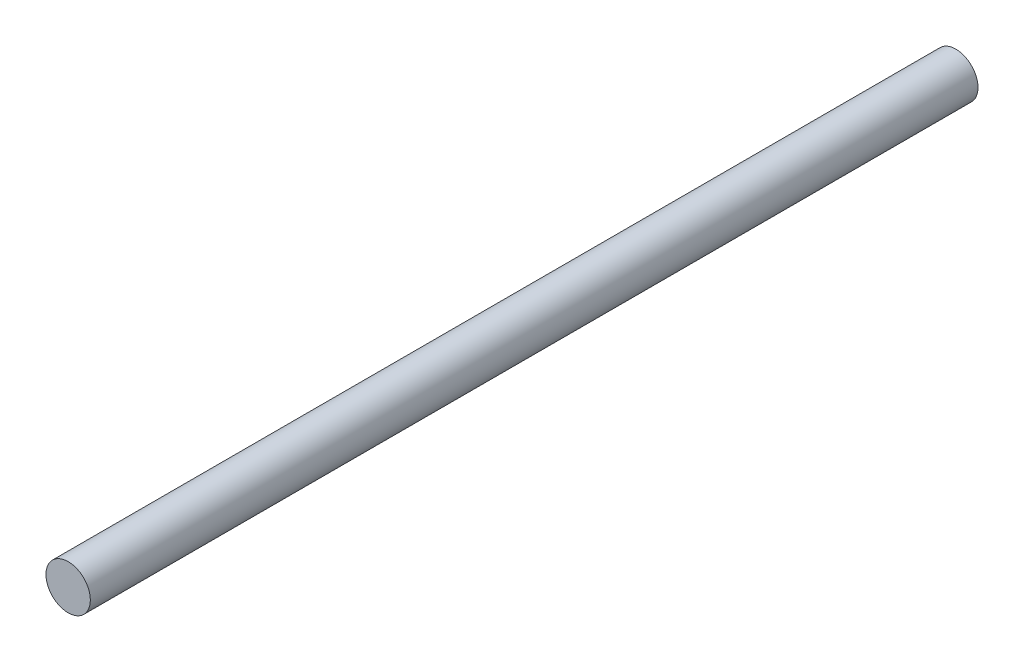
ISO-10303-21;
HEADER;
FILE_DESCRIPTION(('STEP AP214'),'2;1');
FILE_NAME('part.step','',(''),(''),'','','');
FILE_SCHEMA(('AUTOMOTIVE_DESIGN { 1 0 10303 214 1 1 1 1 }'));
ENDSEC;
DATA;
#1=APPLICATION_CONTEXT('core data for automotive mechanical design processes');
#2=APPLICATION_PROTOCOL_DEFINITION('international standard','automotive_design',2000,#1);
#3=PRODUCT_CONTEXT('',#1,'mechanical');
#4=PRODUCT('Part','Part','',(#3));
#5=PRODUCT_RELATED_PRODUCT_CATEGORY('part','',(#4));
#6=PRODUCT_DEFINITION_FORMATION('','',#4);
#7=PRODUCT_DEFINITION_CONTEXT('part definition',#1,'design');
#8=PRODUCT_DEFINITION('design','',#6,#7);
#9=PRODUCT_DEFINITION_SHAPE('','',#8);
#10=(LENGTH_UNIT() NAMED_UNIT(*) SI_UNIT(.MILLI.,.METRE.));
#11=(NAMED_UNIT(*) PLANE_ANGLE_UNIT() SI_UNIT($,.RADIAN.));
#12=(NAMED_UNIT(*) SI_UNIT($,.STERADIAN.) SOLID_ANGLE_UNIT());
#13=UNCERTAINTY_MEASURE_WITH_UNIT(LENGTH_MEASURE(1.E-05),#10,'distance_accuracy_value','');
#14=(GEOMETRIC_REPRESENTATION_CONTEXT(3) GLOBAL_UNCERTAINTY_ASSIGNED_CONTEXT((#13)) GLOBAL_UNIT_ASSIGNED_CONTEXT((#10,
#11,#12)) REPRESENTATION_CONTEXT('',''));
#15=CARTESIAN_POINT('',(0.,0.,0.));
#16=DIRECTION('',(0.,0.,1.));
#17=DIRECTION('',(1.,0.,0.));
#18=AXIS2_PLACEMENT_3D('',#15,#16,#17);
#19=CARTESIAN_POINT('',(0.,0.,100.));
#20=DIRECTION('',(0.,0.,-1.));
#21=DIRECTION('',(-1.,0.,0.));
#22=AXIS2_PLACEMENT_3D('',#19,#20,#21);
#23=CYLINDRICAL_SURFACE('',#22,2.5);
#24=CARTESIAN_POINT('',(0.,0.,100.));
#25=DIRECTION('',(0.,0.,1.));
#26=DIRECTION('',(1.,0.,0.));
#27=AXIS2_PLACEMENT_3D('',#24,#25,#26);
#28=CIRCLE('',#27,2.5);
#29=CARTESIAN_POINT('',(2.5,0.,100.));
#30=VERTEX_POINT('',#29);
#31=EDGE_CURVE('E10',#30,#30,#28,.T.);
#32=ORIENTED_EDGE('',*,*,#31,.F.);
#33=EDGE_LOOP('',(#32));
#34=FACE_BOUND('',#33,.T.);
#35=CARTESIAN_POINT('',(0.,0.,0.));
#36=DIRECTION('',(0.,0.,1.));
#37=DIRECTION('',(1.,0.,0.));
#38=AXIS2_PLACEMENT_3D('',#35,#36,#37);
#39=CIRCLE('',#38,2.5);
#40=CARTESIAN_POINT('',(2.5,0.,0.));
#41=VERTEX_POINT('',#40);
#42=EDGE_CURVE('E38',#41,#41,#39,.T.);
#43=ORIENTED_EDGE('',*,*,#42,.T.);
#44=EDGE_LOOP('',(#43));
#45=FACE_BOUND('',#44,.T.);
#46=ADVANCED_FACE('F35',(#34,#45),#23,.T.);
#47=CARTESIAN_POINT('',(0.,0.,100.));
#48=DIRECTION('',(0.,0.,1.));
#49=DIRECTION('',(1.,0.,0.));
#50=AXIS2_PLACEMENT_3D('',#47,#48,#49);
#51=PLANE('',#50);
#52=ORIENTED_EDGE('',*,*,#31,.T.);
#53=EDGE_LOOP('',(#52));
#54=FACE_BOUND('',#53,.T.);
#55=ADVANCED_FACE('F50',(#54),#51,.T.);
#56=CARTESIAN_POINT('',(0.,0.,0.));
#57=DIRECTION('',(0.,0.,1.));
#58=DIRECTION('',(1.,0.,0.));
#59=AXIS2_PLACEMENT_3D('',#56,#57,#58);
#60=PLANE('',#59);
#61=ORIENTED_EDGE('',*,*,#42,.F.);
#62=EDGE_LOOP('',(#61));
#63=FACE_BOUND('',#62,.T.);
#64=ADVANCED_FACE('F48',(#63),#60,.F.);
#65=CLOSED_SHELL('',(#46,#55,#64));
#66=MANIFOLD_SOLID_BREP('B2',#65);
#67=ADVANCED_BREP_SHAPE_REPRESENTATION('',(#18,#66),#14);
#68=SHAPE_DEFINITION_REPRESENTATION(#9,#67);
ENDSEC;
END-ISO-10303-21;
